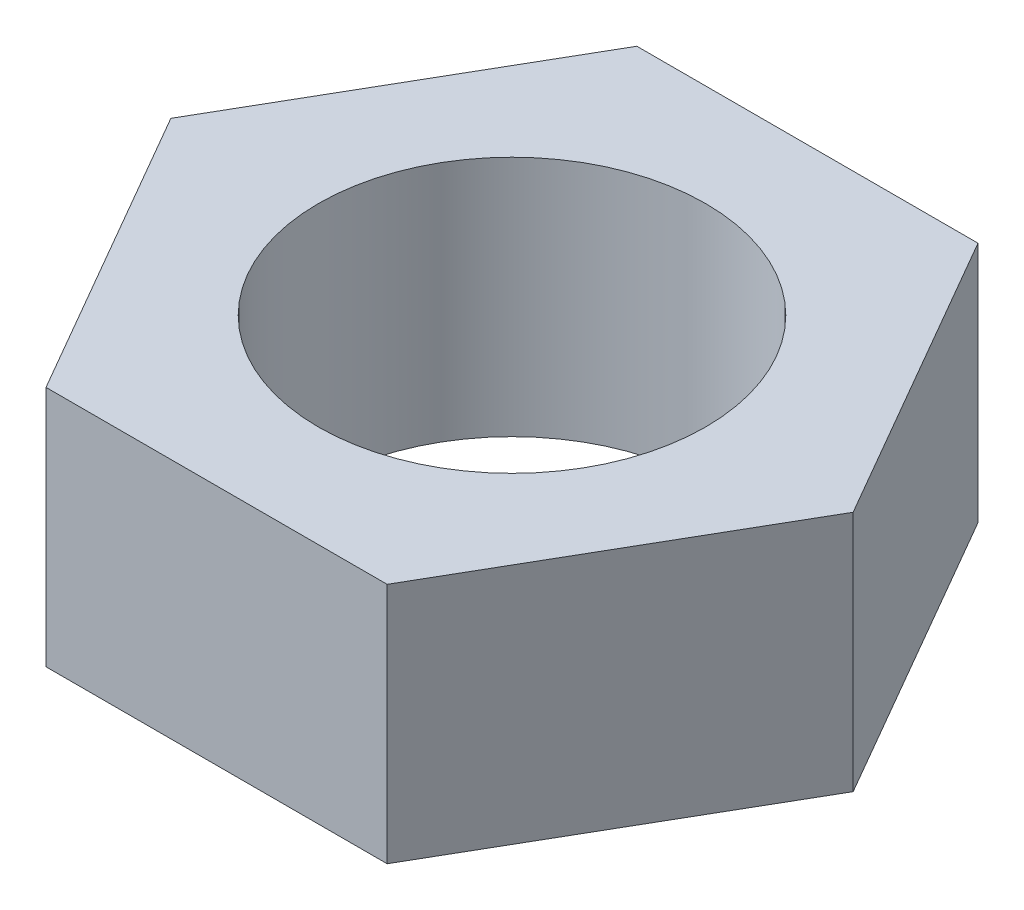
ISO-10303-21;
HEADER;
FILE_DESCRIPTION(('STEP AP214'),'2;1');
FILE_NAME('part.step','',(''),(''),'','','');
FILE_SCHEMA(('AUTOMOTIVE_DESIGN { 1 0 10303 214 1 1 1 1 }'));
ENDSEC;
DATA;
#1=APPLICATION_CONTEXT('core data for automotive mechanical design processes');
#2=APPLICATION_PROTOCOL_DEFINITION('international standard','automotive_design',2000,#1);
#3=PRODUCT_CONTEXT('',#1,'mechanical');
#4=PRODUCT('Part','Part','',(#3));
#5=PRODUCT_RELATED_PRODUCT_CATEGORY('part','',(#4));
#6=PRODUCT_DEFINITION_FORMATION('','',#4);
#7=PRODUCT_DEFINITION_CONTEXT('part definition',#1,'design');
#8=PRODUCT_DEFINITION('design','',#6,#7);
#9=PRODUCT_DEFINITION_SHAPE('','',#8);
#10=(LENGTH_UNIT() NAMED_UNIT(*) SI_UNIT(.MILLI.,.METRE.));
#11=(NAMED_UNIT(*) PLANE_ANGLE_UNIT() SI_UNIT($,.RADIAN.));
#12=(NAMED_UNIT(*) SI_UNIT($,.STERADIAN.) SOLID_ANGLE_UNIT());
#13=UNCERTAINTY_MEASURE_WITH_UNIT(LENGTH_MEASURE(1.E-05),#10,'distance_accuracy_value','');
#14=(GEOMETRIC_REPRESENTATION_CONTEXT(3) GLOBAL_UNCERTAINTY_ASSIGNED_CONTEXT((#13)) GLOBAL_UNIT_ASSIGNED_CONTEXT((#10,
#11,#12)) REPRESENTATION_CONTEXT('',''));
#15=CARTESIAN_POINT('',(0.,0.,0.));
#16=DIRECTION('',(0.,0.,1.));
#17=DIRECTION('',(1.,0.,0.));
#18=AXIS2_PLACEMENT_3D('',#15,#16,#17);
#19=CARTESIAN_POINT('',(0.,5.,0.));
#20=DIRECTION('',(0.,1.,0.));
#21=DIRECTION('',(0.,0.,1.));
#22=AXIS2_PLACEMENT_3D('',#19,#20,#21);
#23=PLANE('',#22);
#24=DIRECTION('',(0.499999999999999,0.,-0.866025403784439));
#25=VECTOR('',#24,1.);
#26=CARTESIAN_POINT('',(3.52400854676548,5.,6.10376184930481));
#27=LINE('',#26,#25);
#28=CARTESIAN_POINT('',(3.52400854676548,5.,6.10376184930481));
#29=VERTEX_POINT('',#28);
#30=CARTESIAN_POINT('',(7.04801709353097,5.,0.));
#31=VERTEX_POINT('',#30);
#32=EDGE_CURVE('E130',#29,#31,#27,.T.);
#33=ORIENTED_EDGE('',*,*,#32,.T.);
#34=DIRECTION('',(-0.5,0.,-0.866025403784438));
#35=VECTOR('',#34,1.);
#36=CARTESIAN_POINT('',(7.04801709353097,5.,0.));
#37=LINE('',#36,#35);
#38=CARTESIAN_POINT('',(3.52400854676547,5.,-6.10376184930482));
#39=VERTEX_POINT('',#38);
#40=EDGE_CURVE('E88',#31,#39,#37,.T.);
#41=ORIENTED_EDGE('',*,*,#40,.T.);
#42=DIRECTION('',(-1.,0.,0.));
#43=VECTOR('',#42,1.);
#44=CARTESIAN_POINT('',(3.52400854676547,5.,-6.10376184930482));
#45=LINE('',#44,#43);
#46=CARTESIAN_POINT('',(-3.5240085467655,5.,-6.10376184930482));
#47=VERTEX_POINT('',#46);
#48=EDGE_CURVE('E101',#39,#47,#45,.T.);
#49=ORIENTED_EDGE('',*,*,#48,.T.);
#50=DIRECTION('',(-0.499999999999999,0.,0.866025403784439));
#51=VECTOR('',#50,1.);
#52=CARTESIAN_POINT('',(-3.5240085467655,5.,-6.10376184930482));
#53=LINE('',#52,#51);
#54=CARTESIAN_POINT('',(-7.048017093531,5.,0.));
#55=VERTEX_POINT('',#54);
#56=EDGE_CURVE('E95',#47,#55,#53,.T.);
#57=ORIENTED_EDGE('',*,*,#56,.T.);
#58=DIRECTION('',(0.5,0.,0.866025403784438));
#59=VECTOR('',#58,1.);
#60=CARTESIAN_POINT('',(-7.048017093531,5.,0.));
#61=LINE('',#60,#59);
#62=CARTESIAN_POINT('',(-3.5240085467655,5.,6.10376184930481));
#63=VERTEX_POINT('',#62);
#64=EDGE_CURVE('E99',#55,#63,#61,.T.);
#65=ORIENTED_EDGE('',*,*,#64,.T.);
#66=DIRECTION('',(1.,0.,0.));
#67=VECTOR('',#66,1.);
#68=CARTESIAN_POINT('',(-3.5240085467655,5.,6.10376184930481));
#69=LINE('',#68,#67);
#70=EDGE_CURVE('E51',#63,#29,#69,.T.);
#71=ORIENTED_EDGE('',*,*,#70,.T.);
#72=EDGE_LOOP('',(#33,#41,#49,#57,#65,#71));
#73=FACE_BOUND('',#72,.T.);
#74=CARTESIAN_POINT('',(0.,5.,0.));
#75=DIRECTION('',(0.,1.,0.));
#76=DIRECTION('',(0.,0.,1.));
#77=AXIS2_PLACEMENT_3D('',#74,#75,#76);
#78=CIRCLE('',#77,4.);
#79=CARTESIAN_POINT('',(0.,5.,4.));
#80=VERTEX_POINT('',#79);
#81=EDGE_CURVE('E123',#80,#80,#78,.T.);
#82=ORIENTED_EDGE('',*,*,#81,.F.);
#83=EDGE_LOOP('',(#82));
#84=FACE_BOUND('',#83,.T.);
#85=ADVANCED_FACE('F34',(#73,#84),#23,.T.);
#86=CARTESIAN_POINT('',(0.,0.,0.));
#87=DIRECTION('',(0.,1.,0.));
#88=DIRECTION('',(0.,0.,1.));
#89=AXIS2_PLACEMENT_3D('',#86,#87,#88);
#90=PLANE('',#89);
#91=DIRECTION('',(0.499999999999999,0.,-0.866025403784439));
#92=VECTOR('',#91,1.);
#93=CARTESIAN_POINT('',(3.52400854676548,0.,6.10376184930481));
#94=LINE('',#93,#92);
#95=CARTESIAN_POINT('',(3.52400854676548,0.,6.10376184930481));
#96=VERTEX_POINT('',#95);
#97=CARTESIAN_POINT('',(7.04801709353097,0.,0.));
#98=VERTEX_POINT('',#97);
#99=EDGE_CURVE('E119',#96,#98,#94,.T.);
#100=ORIENTED_EDGE('',*,*,#99,.F.);
#101=DIRECTION('',(1.,0.,0.));
#102=VECTOR('',#101,1.);
#103=CARTESIAN_POINT('',(-3.5240085467655,0.,6.10376184930481));
#104=LINE('',#103,#102);
#105=CARTESIAN_POINT('',(-3.5240085467655,0.,6.10376184930481));
#106=VERTEX_POINT('',#105);
#107=EDGE_CURVE('E80',#106,#96,#104,.T.);
#108=ORIENTED_EDGE('',*,*,#107,.F.);
#109=DIRECTION('',(0.5,0.,0.866025403784438));
#110=VECTOR('',#109,1.);
#111=CARTESIAN_POINT('',(-7.048017093531,0.,0.));
#112=LINE('',#111,#110);
#113=CARTESIAN_POINT('',(-7.048017093531,0.,0.));
#114=VERTEX_POINT('',#113);
#115=EDGE_CURVE('E74',#114,#106,#112,.T.);
#116=ORIENTED_EDGE('',*,*,#115,.F.);
#117=DIRECTION('',(-0.499999999999999,0.,0.866025403784439));
#118=VECTOR('',#117,1.);
#119=CARTESIAN_POINT('',(-3.5240085467655,0.,-6.10376184930482));
#120=LINE('',#119,#118);
#121=CARTESIAN_POINT('',(-3.5240085467655,0.,-6.10376184930482));
#122=VERTEX_POINT('',#121);
#123=EDGE_CURVE('E109',#122,#114,#120,.T.);
#124=ORIENTED_EDGE('',*,*,#123,.F.);
#125=DIRECTION('',(-1.,0.,0.));
#126=VECTOR('',#125,1.);
#127=CARTESIAN_POINT('',(3.52400854676547,0.,-6.10376184930482));
#128=LINE('',#127,#126);
#129=CARTESIAN_POINT('',(3.52400854676547,0.,-6.10376184930482));
#130=VERTEX_POINT('',#129);
#131=EDGE_CURVE('E125',#130,#122,#128,.T.);
#132=ORIENTED_EDGE('',*,*,#131,.F.);
#133=DIRECTION('',(-0.5,0.,-0.866025403784438));
#134=VECTOR('',#133,1.);
#135=CARTESIAN_POINT('',(7.04801709353097,0.,0.));
#136=LINE('',#135,#134);
#137=EDGE_CURVE('E122',#98,#130,#136,.T.);
#138=ORIENTED_EDGE('',*,*,#137,.F.);
#139=EDGE_LOOP('',(#100,#108,#116,#124,#132,#138));
#140=FACE_BOUND('',#139,.T.);
#141=CARTESIAN_POINT('',(0.,0.,0.));
#142=DIRECTION('',(0.,1.,0.));
#143=DIRECTION('',(0.,0.,1.));
#144=AXIS2_PLACEMENT_3D('',#141,#142,#143);
#145=CIRCLE('',#144,4.);
#146=CARTESIAN_POINT('',(0.,0.,4.));
#147=VERTEX_POINT('',#146);
#148=EDGE_CURVE('E223',#147,#147,#145,.T.);
#149=ORIENTED_EDGE('',*,*,#148,.T.);
#150=EDGE_LOOP('',(#149));
#151=FACE_BOUND('',#150,.T.);
#152=ADVANCED_FACE('F139',(#140,#151),#90,.F.);
#153=CARTESIAN_POINT('',(3.52400854676548,5.,6.10376184930481));
#154=DIRECTION('',(-0.866025403784439,0.,-0.499999999999999));
#155=DIRECTION('',(-0.499999999999999,0.,0.866025403784439));
#156=AXIS2_PLACEMENT_3D('',#153,#154,#155);
#157=PLANE('',#156);
#158=ORIENTED_EDGE('',*,*,#99,.T.);
#159=DIRECTION('',(0.,-1.,0.));
#160=VECTOR('',#159,1.);
#161=CARTESIAN_POINT('',(7.04801709353097,5.,0.));
#162=LINE('',#161,#160);
#163=EDGE_CURVE('E11',#31,#98,#162,.T.);
#164=ORIENTED_EDGE('',*,*,#163,.F.);
#165=ORIENTED_EDGE('',*,*,#32,.F.);
#166=DIRECTION('',(0.,-1.,0.));
#167=VECTOR('',#166,1.);
#168=CARTESIAN_POINT('',(3.52400854676548,5.,6.10376184930481));
#169=LINE('',#168,#167);
#170=EDGE_CURVE('E115',#29,#96,#169,.T.);
#171=ORIENTED_EDGE('',*,*,#170,.T.);
#172=EDGE_LOOP('',(#158,#164,#165,#171));
#173=FACE_BOUND('',#172,.T.);
#174=ADVANCED_FACE('F36',(#173),#157,.F.);
#175=CARTESIAN_POINT('',(7.04801709353097,5.,0.));
#176=DIRECTION('',(-0.866025403784438,0.,0.5));
#177=DIRECTION('',(0.5,0.,0.866025403784438));
#178=AXIS2_PLACEMENT_3D('',#175,#176,#177);
#179=PLANE('',#178);
#180=ORIENTED_EDGE('',*,*,#137,.T.);
#181=DIRECTION('',(0.,-1.,0.));
#182=VECTOR('',#181,1.);
#183=CARTESIAN_POINT('',(3.52400854676547,5.,-6.10376184930482));
#184=LINE('',#183,#182);
#185=EDGE_CURVE('E43',#39,#130,#184,.T.);
#186=ORIENTED_EDGE('',*,*,#185,.F.);
#187=ORIENTED_EDGE('',*,*,#40,.F.);
#188=ORIENTED_EDGE('',*,*,#163,.T.);
#189=EDGE_LOOP('',(#180,#186,#187,#188));
#190=FACE_BOUND('',#189,.T.);
#191=ADVANCED_FACE('F164',(#190),#179,.F.);
#192=CARTESIAN_POINT('',(3.52400854676547,5.,-6.10376184930482));
#193=DIRECTION('',(0.,0.,1.));
#194=DIRECTION('',(1.,0.,0.));
#195=AXIS2_PLACEMENT_3D('',#192,#193,#194);
#196=PLANE('',#195);
#197=ORIENTED_EDGE('',*,*,#131,.T.);
#198=DIRECTION('',(0.,-1.,0.));
#199=VECTOR('',#198,1.);
#200=CARTESIAN_POINT('',(-3.5240085467655,5.,-6.10376184930482));
#201=LINE('',#200,#199);
#202=EDGE_CURVE('E110',#47,#122,#201,.T.);
#203=ORIENTED_EDGE('',*,*,#202,.F.);
#204=ORIENTED_EDGE('',*,*,#48,.F.);
#205=ORIENTED_EDGE('',*,*,#185,.T.);
#206=EDGE_LOOP('',(#197,#203,#204,#205));
#207=FACE_BOUND('',#206,.T.);
#208=ADVANCED_FACE('F136',(#207),#196,.F.);
#209=CARTESIAN_POINT('',(-3.5240085467655,5.,-6.10376184930482));
#210=DIRECTION('',(0.866025403784439,0.,0.5));
#211=DIRECTION('',(0.5,0.,-0.866025403784439));
#212=AXIS2_PLACEMENT_3D('',#209,#210,#211);
#213=PLANE('',#212);
#214=ORIENTED_EDGE('',*,*,#123,.T.);
#215=DIRECTION('',(0.,-1.,0.));
#216=VECTOR('',#215,1.);
#217=CARTESIAN_POINT('',(-7.048017093531,5.,0.));
#218=LINE('',#217,#216);
#219=EDGE_CURVE('E106',#55,#114,#218,.T.);
#220=ORIENTED_EDGE('',*,*,#219,.F.);
#221=ORIENTED_EDGE('',*,*,#56,.F.);
#222=ORIENTED_EDGE('',*,*,#202,.T.);
#223=EDGE_LOOP('',(#214,#220,#221,#222));
#224=FACE_BOUND('',#223,.T.);
#225=ADVANCED_FACE('F107',(#224),#213,.F.);
#226=CARTESIAN_POINT('',(-7.048017093531,5.,0.));
#227=DIRECTION('',(0.866025403784439,0.,-0.5));
#228=DIRECTION('',(-0.5,0.,-0.866025403784439));
#229=AXIS2_PLACEMENT_3D('',#226,#227,#228);
#230=PLANE('',#229);
#231=ORIENTED_EDGE('',*,*,#115,.T.);
#232=DIRECTION('',(0.,-1.,0.));
#233=VECTOR('',#232,1.);
#234=CARTESIAN_POINT('',(-3.5240085467655,5.,6.10376184930481));
#235=LINE('',#234,#233);
#236=EDGE_CURVE('E111',#63,#106,#235,.T.);
#237=ORIENTED_EDGE('',*,*,#236,.F.);
#238=ORIENTED_EDGE('',*,*,#64,.F.);
#239=ORIENTED_EDGE('',*,*,#219,.T.);
#240=EDGE_LOOP('',(#231,#237,#238,#239));
#241=FACE_BOUND('',#240,.T.);
#242=ADVANCED_FACE('F113',(#241),#230,.F.);
#243=CARTESIAN_POINT('',(-3.5240085467655,5.,6.10376184930481));
#244=DIRECTION('',(0.,0.,-1.));
#245=DIRECTION('',(-1.,0.,0.));
#246=AXIS2_PLACEMENT_3D('',#243,#244,#245);
#247=PLANE('',#246);
#248=ORIENTED_EDGE('',*,*,#107,.T.);
#249=ORIENTED_EDGE('',*,*,#170,.F.);
#250=ORIENTED_EDGE('',*,*,#70,.F.);
#251=ORIENTED_EDGE('',*,*,#236,.T.);
#252=EDGE_LOOP('',(#248,#249,#250,#251));
#253=FACE_BOUND('',#252,.T.);
#254=ADVANCED_FACE('F144',(#253),#247,.F.);
#255=CARTESIAN_POINT('',(0.,5.,0.));
#256=DIRECTION('',(0.,-1.,0.));
#257=DIRECTION('',(0.,0.,-1.));
#258=AXIS2_PLACEMENT_3D('',#255,#256,#257);
#259=CYLINDRICAL_SURFACE('',#258,4.);
#260=ORIENTED_EDGE('',*,*,#81,.T.);
#261=EDGE_LOOP('',(#260));
#262=FACE_BOUND('',#261,.T.);
#263=ORIENTED_EDGE('',*,*,#148,.F.);
#264=EDGE_LOOP('',(#263));
#265=FACE_BOUND('',#264,.T.);
#266=ADVANCED_FACE('F146',(#262,#265),#259,.F.);
#267=CLOSED_SHELL('',(#85,#152,#174,#191,#208,#225,#242,#254,#266));
#268=MANIFOLD_SOLID_BREP('B2',#267);
#269=ADVANCED_BREP_SHAPE_REPRESENTATION('',(#18,#268),#14);
#270=SHAPE_DEFINITION_REPRESENTATION(#9,#269);
ENDSEC;
END-ISO-10303-21;
